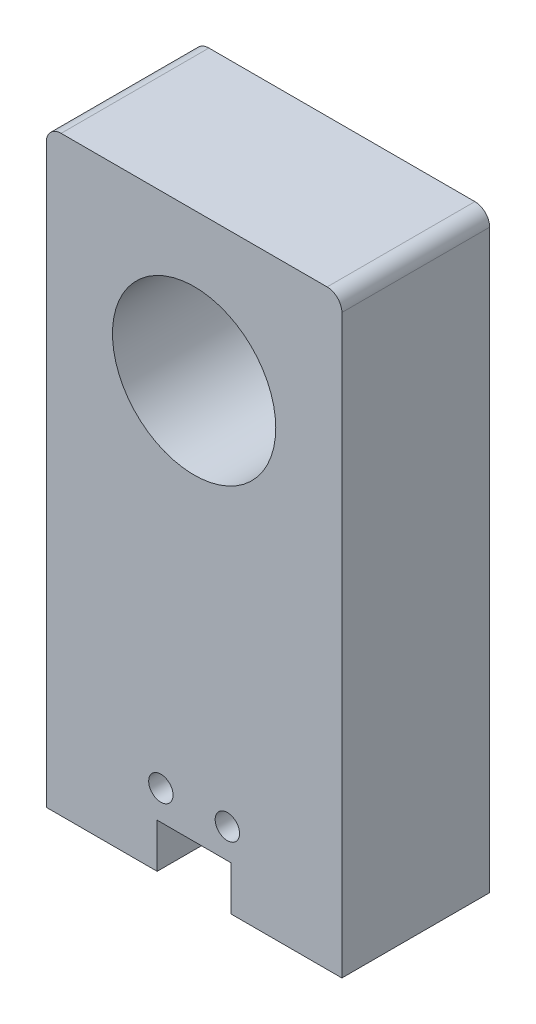
ISO-10303-21;
HEADER;
FILE_DESCRIPTION(('STEP AP214'),'2;1');
FILE_NAME('part.step','',(''),(''),'','','');
FILE_SCHEMA(('AUTOMOTIVE_DESIGN { 1 0 10303 214 1 1 1 1 }'));
ENDSEC;
DATA;
#1=APPLICATION_CONTEXT('core data for automotive mechanical design processes');
#2=APPLICATION_PROTOCOL_DEFINITION('international standard','automotive_design',2000,#1);
#3=PRODUCT_CONTEXT('',#1,'mechanical');
#4=PRODUCT('Part','Part','',(#3));
#5=PRODUCT_RELATED_PRODUCT_CATEGORY('part','',(#4));
#6=PRODUCT_DEFINITION_FORMATION('','',#4);
#7=PRODUCT_DEFINITION_CONTEXT('part definition',#1,'design');
#8=PRODUCT_DEFINITION('design','',#6,#7);
#9=PRODUCT_DEFINITION_SHAPE('','',#8);
#10=(LENGTH_UNIT() NAMED_UNIT(*) SI_UNIT(.MILLI.,.METRE.));
#11=(NAMED_UNIT(*) PLANE_ANGLE_UNIT() SI_UNIT($,.RADIAN.));
#12=(NAMED_UNIT(*) SI_UNIT($,.STERADIAN.) SOLID_ANGLE_UNIT());
#13=UNCERTAINTY_MEASURE_WITH_UNIT(LENGTH_MEASURE(1.E-05),#10,'distance_accuracy_value','');
#14=(GEOMETRIC_REPRESENTATION_CONTEXT(3) GLOBAL_UNCERTAINTY_ASSIGNED_CONTEXT((#13)) GLOBAL_UNIT_ASSIGNED_CONTEXT((#10,
#11,#12)) REPRESENTATION_CONTEXT('',''));
#15=CARTESIAN_POINT('',(0.,0.,0.));
#16=DIRECTION('',(0.,0.,1.));
#17=DIRECTION('',(1.,0.,0.));
#18=AXIS2_PLACEMENT_3D('',#15,#16,#17);
#19=CARTESIAN_POINT('',(0.,-60.,0.));
#20=DIRECTION('',(0.,1.,0.));
#21=DIRECTION('',(0.,0.,1.));
#22=AXIS2_PLACEMENT_3D('',#19,#20,#21);
#23=PLANE('',#22);
#24=DIRECTION('',(0.,0.,1.));
#25=VECTOR('',#24,1.);
#26=CARTESIAN_POINT('',(5.,-60.,8.));
#27=LINE('',#26,#25);
#28=CARTESIAN_POINT('',(5.,-60.,8.));
#29=VERTEX_POINT('',#28);
#30=CARTESIAN_POINT('',(5.,-60.,20.));
#31=VERTEX_POINT('',#30);
#32=EDGE_CURVE('E131',#29,#31,#27,.T.);
#33=ORIENTED_EDGE('',*,*,#32,.F.);
#34=DIRECTION('',(1.,0.,0.));
#35=VECTOR('',#34,1.);
#36=CARTESIAN_POINT('',(-5.,-60.,8.));
#37=LINE('',#36,#35);
#38=CARTESIAN_POINT('',(-5.,-60.,8.));
#39=VERTEX_POINT('',#38);
#40=EDGE_CURVE('E150',#39,#29,#37,.T.);
#41=ORIENTED_EDGE('',*,*,#40,.F.);
#42=DIRECTION('',(0.,0.,-1.));
#43=VECTOR('',#42,1.);
#44=CARTESIAN_POINT('',(-5.,-60.,8.));
#45=LINE('',#44,#43);
#46=CARTESIAN_POINT('',(-5.,-60.,20.));
#47=VERTEX_POINT('',#46);
#48=EDGE_CURVE('E162',#47,#39,#45,.T.);
#49=ORIENTED_EDGE('',*,*,#48,.F.);
#50=DIRECTION('',(-1.,0.,0.));
#51=VECTOR('',#50,1.);
#52=CARTESIAN_POINT('',(-20.,-60.,20.));
#53=LINE('',#52,#51);
#54=CARTESIAN_POINT('',(-20.,-60.,20.));
#55=VERTEX_POINT('',#54);
#56=EDGE_CURVE('E188',#47,#55,#53,.T.);
#57=ORIENTED_EDGE('',*,*,#56,.T.);
#58=DIRECTION('',(0.,0.,-1.));
#59=VECTOR('',#58,1.);
#60=CARTESIAN_POINT('',(-20.,-60.,0.));
#61=LINE('',#60,#59);
#62=CARTESIAN_POINT('',(-20.,-60.,0.));
#63=VERTEX_POINT('',#62);
#64=EDGE_CURVE('E194',#55,#63,#61,.T.);
#65=ORIENTED_EDGE('',*,*,#64,.T.);
#66=DIRECTION('',(1.,0.,0.));
#67=VECTOR('',#66,1.);
#68=CARTESIAN_POINT('',(-20.,-60.,0.));
#69=LINE('',#68,#67);
#70=CARTESIAN_POINT('',(20.,-60.,0.));
#71=VERTEX_POINT('',#70);
#72=EDGE_CURVE('E197',#63,#71,#69,.T.);
#73=ORIENTED_EDGE('',*,*,#72,.T.);
#74=DIRECTION('',(0.,0.,1.));
#75=VECTOR('',#74,1.);
#76=CARTESIAN_POINT('',(20.,-60.,0.));
#77=LINE('',#76,#75);
#78=CARTESIAN_POINT('',(20.,-60.,20.));
#79=VERTEX_POINT('',#78);
#80=EDGE_CURVE('E187',#71,#79,#77,.T.);
#81=ORIENTED_EDGE('',*,*,#80,.T.);
#82=EDGE_CURVE('E195',#79,#31,#53,.T.);
#83=ORIENTED_EDGE('',*,*,#82,.T.);
#84=EDGE_LOOP('',(#33,#41,#49,#57,#65,#73,#81,#83));
#85=FACE_BOUND('',#84,.T.);
#86=ADVANCED_FACE('F44',(#85),#23,.F.);
#87=CARTESIAN_POINT('',(20.,-20.,20.));
#88=DIRECTION('',(-1.,0.,0.));
#89=DIRECTION('',(0.,0.,1.));
#90=AXIS2_PLACEMENT_3D('',#87,#88,#89);
#91=PLANE('',#90);
#92=DIRECTION('',(0.,1.,0.));
#93=VECTOR('',#92,1.);
#94=CARTESIAN_POINT('',(20.,-20.,0.));
#95=LINE('',#94,#93);
#96=CARTESIAN_POINT('',(20.,18.,0.));
#97=VERTEX_POINT('',#96);
#98=EDGE_CURVE('E206',#71,#97,#95,.T.);
#99=ORIENTED_EDGE('',*,*,#98,.T.);
#100=DIRECTION('',(0.,0.,-1.));
#101=VECTOR('',#100,1.);
#102=CARTESIAN_POINT('',(20.,18.,20.));
#103=LINE('',#102,#101);
#104=CARTESIAN_POINT('',(20.,18.,20.));
#105=VERTEX_POINT('',#104);
#106=EDGE_CURVE('E67',#97,#105,#103,.F.);
#107=ORIENTED_EDGE('',*,*,#106,.T.);
#108=DIRECTION('',(0.,1.,0.));
#109=VECTOR('',#108,1.);
#110=CARTESIAN_POINT('',(20.,-20.,20.));
#111=LINE('',#110,#109);
#112=EDGE_CURVE('E215',#79,#105,#111,.T.);
#113=ORIENTED_EDGE('',*,*,#112,.F.);
#114=ORIENTED_EDGE('',*,*,#80,.F.);
#115=EDGE_LOOP('',(#99,#107,#113,#114));
#116=FACE_BOUND('',#115,.T.);
#117=ADVANCED_FACE('F268',(#116),#91,.F.);
#118=CARTESIAN_POINT('',(-20.,20.,20.));
#119=DIRECTION('',(0.,-1.,0.));
#120=DIRECTION('',(0.,0.,-1.));
#121=AXIS2_PLACEMENT_3D('',#118,#119,#120);
#122=PLANE('',#121);
#123=DIRECTION('',(-1.,0.,0.));
#124=VECTOR('',#123,1.);
#125=CARTESIAN_POINT('',(-20.,20.,20.));
#126=LINE('',#125,#124);
#127=CARTESIAN_POINT('',(18.,20.,20.));
#128=VERTEX_POINT('',#127);
#129=CARTESIAN_POINT('',(-18.,20.,20.));
#130=VERTEX_POINT('',#129);
#131=EDGE_CURVE('E214',#128,#130,#126,.T.);
#132=ORIENTED_EDGE('',*,*,#131,.F.);
#133=DIRECTION('',(0.,0.,-1.));
#134=VECTOR('',#133,1.);
#135=CARTESIAN_POINT('',(18.,20.,20.));
#136=LINE('',#135,#134);
#137=CARTESIAN_POINT('',(18.,20.,0.));
#138=VERTEX_POINT('',#137);
#139=EDGE_CURVE('E237',#128,#138,#136,.T.);
#140=ORIENTED_EDGE('',*,*,#139,.T.);
#141=DIRECTION('',(-1.,0.,0.));
#142=VECTOR('',#141,1.);
#143=CARTESIAN_POINT('',(-20.,20.,0.));
#144=LINE('',#143,#142);
#145=CARTESIAN_POINT('',(-18.,20.,0.));
#146=VERTEX_POINT('',#145);
#147=EDGE_CURVE('E224',#138,#146,#144,.T.);
#148=ORIENTED_EDGE('',*,*,#147,.T.);
#149=DIRECTION('',(0.,0.,-1.));
#150=VECTOR('',#149,1.);
#151=CARTESIAN_POINT('',(-18.,20.,20.));
#152=LINE('',#151,#150);
#153=EDGE_CURVE('E225',#146,#130,#152,.F.);
#154=ORIENTED_EDGE('',*,*,#153,.T.);
#155=EDGE_LOOP('',(#132,#140,#148,#154));
#156=FACE_BOUND('',#155,.T.);
#157=ADVANCED_FACE('F257',(#156),#122,.F.);
#158=CARTESIAN_POINT('',(-20.,-20.,20.));
#159=DIRECTION('',(1.,0.,0.));
#160=DIRECTION('',(0.,0.,-1.));
#161=AXIS2_PLACEMENT_3D('',#158,#159,#160);
#162=PLANE('',#161);
#163=DIRECTION('',(0.,-1.,0.));
#164=VECTOR('',#163,1.);
#165=CARTESIAN_POINT('',(-20.,-20.,20.));
#166=LINE('',#165,#164);
#167=CARTESIAN_POINT('',(-20.,18.,20.));
#168=VERTEX_POINT('',#167);
#169=EDGE_CURVE('E217',#168,#55,#166,.T.);
#170=ORIENTED_EDGE('',*,*,#169,.F.);
#171=DIRECTION('',(0.,0.,-1.));
#172=VECTOR('',#171,1.);
#173=CARTESIAN_POINT('',(-20.,18.,20.));
#174=LINE('',#173,#172);
#175=CARTESIAN_POINT('',(-20.,18.,0.));
#176=VERTEX_POINT('',#175);
#177=EDGE_CURVE('E11',#168,#176,#174,.T.);
#178=ORIENTED_EDGE('',*,*,#177,.T.);
#179=DIRECTION('',(0.,-1.,0.));
#180=VECTOR('',#179,1.);
#181=CARTESIAN_POINT('',(-20.,-20.,0.));
#182=LINE('',#181,#180);
#183=EDGE_CURVE('E216',#176,#63,#182,.T.);
#184=ORIENTED_EDGE('',*,*,#183,.T.);
#185=ORIENTED_EDGE('',*,*,#64,.F.);
#186=EDGE_LOOP('',(#170,#178,#184,#185));
#187=FACE_BOUND('',#186,.T.);
#188=ADVANCED_FACE('F275',(#187),#162,.F.);
#189=CARTESIAN_POINT('',(0.,0.,20.));
#190=DIRECTION('',(0.,0.,-1.));
#191=DIRECTION('',(-1.,0.,0.));
#192=AXIS2_PLACEMENT_3D('',#189,#190,#191);
#193=PLANE('',#192);
#194=ORIENTED_EDGE('',*,*,#112,.T.);
#195=CARTESIAN_POINT('',(18.,18.,20.));
#196=DIRECTION('',(0.,0.,-1.));
#197=DIRECTION('',(-1.,0.,0.));
#198=AXIS2_PLACEMENT_3D('',#195,#196,#197);
#199=CIRCLE('',#198,2.);
#200=EDGE_CURVE('E53',#105,#128,#199,.F.);
#201=ORIENTED_EDGE('',*,*,#200,.T.);
#202=ORIENTED_EDGE('',*,*,#131,.T.);
#203=CARTESIAN_POINT('',(-18.,18.,20.));
#204=DIRECTION('',(0.,0.,-1.));
#205=DIRECTION('',(-1.,0.,0.));
#206=AXIS2_PLACEMENT_3D('',#203,#204,#205);
#207=CIRCLE('',#206,2.);
#208=EDGE_CURVE('E61',#130,#168,#207,.F.);
#209=ORIENTED_EDGE('',*,*,#208,.T.);
#210=ORIENTED_EDGE('',*,*,#169,.T.);
#211=ORIENTED_EDGE('',*,*,#56,.F.);
#212=DIRECTION('',(0.,-1.,0.));
#213=VECTOR('',#212,1.);
#214=CARTESIAN_POINT('',(-5.,-54.,20.));
#215=LINE('',#214,#213);
#216=CARTESIAN_POINT('',(-5.,-54.,20.));
#217=VERTEX_POINT('',#216);
#218=EDGE_CURVE('E138',#217,#47,#215,.T.);
#219=ORIENTED_EDGE('',*,*,#218,.F.);
#220=DIRECTION('',(-1.,0.,0.));
#221=VECTOR('',#220,1.);
#222=CARTESIAN_POINT('',(-5.,-54.,20.));
#223=LINE('',#222,#221);
#224=CARTESIAN_POINT('',(5.,-54.,20.));
#225=VERTEX_POINT('',#224);
#226=EDGE_CURVE('E141',#225,#217,#223,.T.);
#227=ORIENTED_EDGE('',*,*,#226,.F.);
#228=DIRECTION('',(0.,-1.,0.));
#229=VECTOR('',#228,1.);
#230=CARTESIAN_POINT('',(5.,-54.,20.));
#231=LINE('',#230,#229);
#232=EDGE_CURVE('E123',#225,#31,#231,.T.);
#233=ORIENTED_EDGE('',*,*,#232,.T.);
#234=ORIENTED_EDGE('',*,*,#82,.F.);
#235=EDGE_LOOP('',(#194,#201,#202,#209,#210,#211,#219,#227,#233,#234));
#236=FACE_BOUND('',#235,.T.);
#237=CARTESIAN_POINT('',(4.50000000000001,-50.,20.));
#238=DIRECTION('',(0.,0.,1.));
#239=DIRECTION('',(1.,0.,0.));
#240=AXIS2_PLACEMENT_3D('',#237,#238,#239);
#241=CIRCLE('',#240,1.65);
#242=CARTESIAN_POINT('',(6.15000000000001,-50.,20.));
#243=VERTEX_POINT('',#242);
#244=EDGE_CURVE('E178',#243,#243,#241,.T.);
#245=ORIENTED_EDGE('',*,*,#244,.F.);
#246=EDGE_LOOP('',(#245));
#247=FACE_BOUND('',#246,.T.);
#248=CARTESIAN_POINT('',(-4.49999999999999,-50.,20.));
#249=DIRECTION('',(0.,0.,1.));
#250=DIRECTION('',(1.,0.,0.));
#251=AXIS2_PLACEMENT_3D('',#248,#249,#250);
#252=CIRCLE('',#251,1.65);
#253=CARTESIAN_POINT('',(-2.84999999999999,-50.,20.));
#254=VERTEX_POINT('',#253);
#255=EDGE_CURVE('E171',#254,#254,#252,.T.);
#256=ORIENTED_EDGE('',*,*,#255,.F.);
#257=EDGE_LOOP('',(#256));
#258=FACE_BOUND('',#257,.T.);
#259=CARTESIAN_POINT('',(0.,0.,20.));
#260=DIRECTION('',(0.,0.,1.));
#261=DIRECTION('',(1.,0.,0.));
#262=AXIS2_PLACEMENT_3D('',#259,#260,#261);
#263=CIRCLE('',#262,11.05);
#264=CARTESIAN_POINT('',(11.05,0.,20.));
#265=VERTEX_POINT('',#264);
#266=EDGE_CURVE('E201',#265,#265,#263,.T.);
#267=ORIENTED_EDGE('',*,*,#266,.F.);
#268=EDGE_LOOP('',(#267));
#269=FACE_BOUND('',#268,.T.);
#270=ADVANCED_FACE('F148',(#236,#247,#258,#269),#193,.F.);
#271=CARTESIAN_POINT('',(0.,0.,0.));
#272=DIRECTION('',(0.,0.,-1.));
#273=DIRECTION('',(-1.,0.,0.));
#274=AXIS2_PLACEMENT_3D('',#271,#272,#273);
#275=PLANE('',#274);
#276=CARTESIAN_POINT('',(4.50000000000001,-50.,0.));
#277=DIRECTION('',(0.,0.,-1.));
#278=DIRECTION('',(-1.,0.,0.));
#279=AXIS2_PLACEMENT_3D('',#276,#277,#278);
#280=CIRCLE('',#279,1.65);
#281=CARTESIAN_POINT('',(2.85000000000001,-50.,0.));
#282=VERTEX_POINT('',#281);
#283=EDGE_CURVE('E191',#282,#282,#280,.T.);
#284=ORIENTED_EDGE('',*,*,#283,.F.);
#285=EDGE_LOOP('',(#284));
#286=FACE_BOUND('',#285,.T.);
#287=CARTESIAN_POINT('',(-4.49999999999999,-50.,0.));
#288=DIRECTION('',(0.,0.,-1.));
#289=DIRECTION('',(-1.,0.,0.));
#290=AXIS2_PLACEMENT_3D('',#287,#288,#289);
#291=CIRCLE('',#290,1.65);
#292=CARTESIAN_POINT('',(-6.14999999999999,-50.,0.));
#293=VERTEX_POINT('',#292);
#294=EDGE_CURVE('E185',#293,#293,#291,.T.);
#295=ORIENTED_EDGE('',*,*,#294,.F.);
#296=EDGE_LOOP('',(#295));
#297=FACE_BOUND('',#296,.T.);
#298=CARTESIAN_POINT('',(0.,0.,0.));
#299=DIRECTION('',(0.,0.,1.));
#300=DIRECTION('',(1.,0.,0.));
#301=AXIS2_PLACEMENT_3D('',#298,#299,#300);
#302=CIRCLE('',#301,11.05);
#303=CARTESIAN_POINT('',(11.05,0.,0.));
#304=VERTEX_POINT('',#303);
#305=EDGE_CURVE('E202',#304,#304,#302,.T.);
#306=ORIENTED_EDGE('',*,*,#305,.T.);
#307=EDGE_LOOP('',(#306));
#308=FACE_BOUND('',#307,.T.);
#309=ORIENTED_EDGE('',*,*,#147,.F.);
#310=CARTESIAN_POINT('',(18.,18.,0.));
#311=DIRECTION('',(0.,0.,-1.));
#312=DIRECTION('',(-1.,0.,0.));
#313=AXIS2_PLACEMENT_3D('',#310,#311,#312);
#314=CIRCLE('',#313,2.);
#315=EDGE_CURVE('E246',#138,#97,#314,.T.);
#316=ORIENTED_EDGE('',*,*,#315,.T.);
#317=ORIENTED_EDGE('',*,*,#98,.F.);
#318=ORIENTED_EDGE('',*,*,#72,.F.);
#319=ORIENTED_EDGE('',*,*,#183,.F.);
#320=CARTESIAN_POINT('',(-18.,18.,0.));
#321=DIRECTION('',(0.,0.,-1.));
#322=DIRECTION('',(-1.,0.,0.));
#323=AXIS2_PLACEMENT_3D('',#320,#321,#322);
#324=CIRCLE('',#323,2.);
#325=EDGE_CURVE('E243',#176,#146,#324,.T.);
#326=ORIENTED_EDGE('',*,*,#325,.T.);
#327=EDGE_LOOP('',(#309,#316,#317,#318,#319,#326));
#328=FACE_BOUND('',#327,.T.);
#329=ADVANCED_FACE('F263',(#286,#297,#308,#328),#275,.T.);
#330=CARTESIAN_POINT('',(0.,0.,0.));
#331=DIRECTION('',(0.,0.,1.));
#332=DIRECTION('',(1.,0.,0.));
#333=AXIS2_PLACEMENT_3D('',#330,#331,#332);
#334=CYLINDRICAL_SURFACE('',#333,11.05);
#335=ORIENTED_EDGE('',*,*,#305,.F.);
#336=EDGE_LOOP('',(#335));
#337=FACE_BOUND('',#336,.T.);
#338=ORIENTED_EDGE('',*,*,#266,.T.);
#339=EDGE_LOOP('',(#338));
#340=FACE_BOUND('',#339,.T.);
#341=ADVANCED_FACE('F293',(#337,#340),#334,.F.);
#342=CARTESIAN_POINT('',(-4.49999999999999,-50.,-20.));
#343=DIRECTION('',(0.,0.,1.));
#344=DIRECTION('',(1.,0.,0.));
#345=AXIS2_PLACEMENT_3D('',#342,#343,#344);
#346=CYLINDRICAL_SURFACE('',#345,1.65);
#347=ORIENTED_EDGE('',*,*,#294,.T.);
#348=EDGE_LOOP('',(#347));
#349=FACE_BOUND('',#348,.T.);
#350=ORIENTED_EDGE('',*,*,#255,.T.);
#351=EDGE_LOOP('',(#350));
#352=FACE_BOUND('',#351,.T.);
#353=ADVANCED_FACE('F287',(#349,#352),#346,.F.);
#354=CARTESIAN_POINT('',(4.50000000000001,-50.,-20.));
#355=DIRECTION('',(0.,0.,1.));
#356=DIRECTION('',(1.,0.,0.));
#357=AXIS2_PLACEMENT_3D('',#354,#355,#356);
#358=CYLINDRICAL_SURFACE('',#357,1.65);
#359=ORIENTED_EDGE('',*,*,#283,.T.);
#360=EDGE_LOOP('',(#359));
#361=FACE_BOUND('',#360,.T.);
#362=ORIENTED_EDGE('',*,*,#244,.T.);
#363=EDGE_LOOP('',(#362));
#364=FACE_BOUND('',#363,.T.);
#365=ADVANCED_FACE('F369',(#361,#364),#358,.F.);
#366=CARTESIAN_POINT('',(5.,-54.,8.));
#367=DIRECTION('',(1.,0.,0.));
#368=DIRECTION('',(0.,0.,-1.));
#369=AXIS2_PLACEMENT_3D('',#366,#367,#368);
#370=PLANE('',#369);
#371=ORIENTED_EDGE('',*,*,#32,.T.);
#372=ORIENTED_EDGE('',*,*,#232,.F.);
#373=DIRECTION('',(0.,0.,1.));
#374=VECTOR('',#373,1.);
#375=CARTESIAN_POINT('',(5.,-54.,8.));
#376=LINE('',#375,#374);
#377=CARTESIAN_POINT('',(5.,-54.,8.));
#378=VERTEX_POINT('',#377);
#379=EDGE_CURVE('E127',#378,#225,#376,.T.);
#380=ORIENTED_EDGE('',*,*,#379,.F.);
#381=DIRECTION('',(0.,-1.,0.));
#382=VECTOR('',#381,1.);
#383=CARTESIAN_POINT('',(5.,-54.,8.));
#384=LINE('',#383,#382);
#385=EDGE_CURVE('E166',#378,#29,#384,.T.);
#386=ORIENTED_EDGE('',*,*,#385,.T.);
#387=EDGE_LOOP('',(#371,#372,#380,#386));
#388=FACE_BOUND('',#387,.T.);
#389=ADVANCED_FACE('F130',(#388),#370,.F.);
#390=CARTESIAN_POINT('',(-5.,-54.,8.));
#391=DIRECTION('',(0.,0.,-1.));
#392=DIRECTION('',(-1.,0.,0.));
#393=AXIS2_PLACEMENT_3D('',#390,#391,#392);
#394=PLANE('',#393);
#395=ORIENTED_EDGE('',*,*,#40,.T.);
#396=ORIENTED_EDGE('',*,*,#385,.F.);
#397=DIRECTION('',(1.,0.,0.));
#398=VECTOR('',#397,1.);
#399=CARTESIAN_POINT('',(-5.,-54.,8.));
#400=LINE('',#399,#398);
#401=CARTESIAN_POINT('',(-5.,-54.,8.));
#402=VERTEX_POINT('',#401);
#403=EDGE_CURVE('E140',#402,#378,#400,.T.);
#404=ORIENTED_EDGE('',*,*,#403,.F.);
#405=DIRECTION('',(0.,-1.,0.));
#406=VECTOR('',#405,1.);
#407=CARTESIAN_POINT('',(-5.,-54.,8.));
#408=LINE('',#407,#406);
#409=EDGE_CURVE('E175',#402,#39,#408,.T.);
#410=ORIENTED_EDGE('',*,*,#409,.T.);
#411=EDGE_LOOP('',(#395,#396,#404,#410));
#412=FACE_BOUND('',#411,.T.);
#413=ADVANCED_FACE('F355',(#412),#394,.F.);
#414=CARTESIAN_POINT('',(-5.,-54.,8.));
#415=DIRECTION('',(-1.,0.,0.));
#416=DIRECTION('',(0.,0.,1.));
#417=AXIS2_PLACEMENT_3D('',#414,#415,#416);
#418=PLANE('',#417);
#419=ORIENTED_EDGE('',*,*,#48,.T.);
#420=ORIENTED_EDGE('',*,*,#409,.F.);
#421=DIRECTION('',(0.,0.,-1.));
#422=VECTOR('',#421,1.);
#423=CARTESIAN_POINT('',(-5.,-54.,8.));
#424=LINE('',#423,#422);
#425=EDGE_CURVE('E153',#217,#402,#424,.T.);
#426=ORIENTED_EDGE('',*,*,#425,.F.);
#427=ORIENTED_EDGE('',*,*,#218,.T.);
#428=EDGE_LOOP('',(#419,#420,#426,#427));
#429=FACE_BOUND('',#428,.T.);
#430=ADVANCED_FACE('F342',(#429),#418,.F.);
#431=CARTESIAN_POINT('',(0.,-54.,0.));
#432=DIRECTION('',(0.,1.,0.));
#433=DIRECTION('',(0.,0.,1.));
#434=AXIS2_PLACEMENT_3D('',#431,#432,#433);
#435=PLANE('',#434);
#436=ORIENTED_EDGE('',*,*,#379,.T.);
#437=ORIENTED_EDGE('',*,*,#226,.T.);
#438=ORIENTED_EDGE('',*,*,#425,.T.);
#439=ORIENTED_EDGE('',*,*,#403,.T.);
#440=EDGE_LOOP('',(#436,#437,#438,#439));
#441=FACE_BOUND('',#440,.T.);
#442=ADVANCED_FACE('F142',(#441),#435,.F.);
#443=CARTESIAN_POINT('',(18.,18.,20.));
#444=DIRECTION('',(0.,0.,-1.));
#445=DIRECTION('',(-1.,0.,0.));
#446=AXIS2_PLACEMENT_3D('',#443,#444,#445);
#447=CYLINDRICAL_SURFACE('',#446,2.);
#448=ORIENTED_EDGE('',*,*,#200,.F.);
#449=ORIENTED_EDGE('',*,*,#106,.F.);
#450=ORIENTED_EDGE('',*,*,#315,.F.);
#451=ORIENTED_EDGE('',*,*,#139,.F.);
#452=EDGE_LOOP('',(#448,#449,#450,#451));
#453=FACE_BOUND('',#452,.T.);
#454=ADVANCED_FACE('F261',(#453),#447,.T.);
#455=CARTESIAN_POINT('',(-18.,18.,20.));
#456=DIRECTION('',(0.,0.,-1.));
#457=DIRECTION('',(-1.,0.,0.));
#458=AXIS2_PLACEMENT_3D('',#455,#456,#457);
#459=CYLINDRICAL_SURFACE('',#458,2.);
#460=ORIENTED_EDGE('',*,*,#208,.F.);
#461=ORIENTED_EDGE('',*,*,#153,.F.);
#462=ORIENTED_EDGE('',*,*,#325,.F.);
#463=ORIENTED_EDGE('',*,*,#177,.F.);
#464=EDGE_LOOP('',(#460,#461,#462,#463));
#465=FACE_BOUND('',#464,.T.);
#466=ADVANCED_FACE('F50',(#465),#459,.T.);
#467=CLOSED_SHELL('',(#86,#117,#157,#188,#270,#329,#341,#353,#365,#389,#413,#430,#442,#454,#466));
#468=MANIFOLD_SOLID_BREP('B2',#467);
#469=ADVANCED_BREP_SHAPE_REPRESENTATION('',(#18,#468),#14);
#470=SHAPE_DEFINITION_REPRESENTATION(#9,#469);
ENDSEC;
END-ISO-10303-21;
